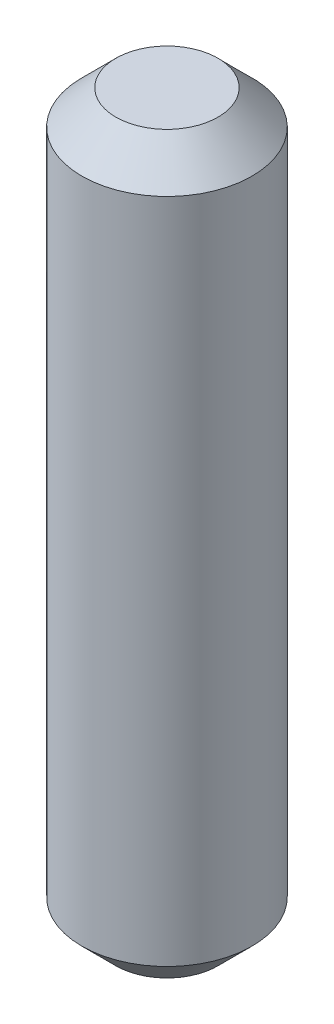
ISO-10303-21;
HEADER;
FILE_DESCRIPTION(('STEP AP214'),'2;1');
FILE_NAME('part.step','',(''),(''),'','','');
FILE_SCHEMA(('AUTOMOTIVE_DESIGN { 1 0 10303 214 1 1 1 1 }'));
ENDSEC;
DATA;
#1=APPLICATION_CONTEXT('core data for automotive mechanical design processes');
#2=APPLICATION_PROTOCOL_DEFINITION('international standard','automotive_design',2000,#1);
#3=PRODUCT_CONTEXT('',#1,'mechanical');
#4=PRODUCT('Part','Part','',(#3));
#5=PRODUCT_RELATED_PRODUCT_CATEGORY('part','',(#4));
#6=PRODUCT_DEFINITION_FORMATION('','',#4);
#7=PRODUCT_DEFINITION_CONTEXT('part definition',#1,'design');
#8=PRODUCT_DEFINITION('design','',#6,#7);
#9=PRODUCT_DEFINITION_SHAPE('','',#8);
#10=(LENGTH_UNIT() NAMED_UNIT(*) SI_UNIT(.MILLI.,.METRE.));
#11=(NAMED_UNIT(*) PLANE_ANGLE_UNIT() SI_UNIT($,.RADIAN.));
#12=(NAMED_UNIT(*) SI_UNIT($,.STERADIAN.) SOLID_ANGLE_UNIT());
#13=UNCERTAINTY_MEASURE_WITH_UNIT(LENGTH_MEASURE(1.E-05),#10,'distance_accuracy_value','');
#14=(GEOMETRIC_REPRESENTATION_CONTEXT(3) GLOBAL_UNCERTAINTY_ASSIGNED_CONTEXT((#13)) GLOBAL_UNIT_ASSIGNED_CONTEXT((#10,
#11,#12)) REPRESENTATION_CONTEXT('',''));
#15=CARTESIAN_POINT('',(0.,0.,0.));
#16=DIRECTION('',(0.,0.,1.));
#17=DIRECTION('',(1.,0.,0.));
#18=AXIS2_PLACEMENT_3D('',#15,#16,#17);
#19=CARTESIAN_POINT('',(0.,21.59,0.));
#20=DIRECTION('',(0.,-1.,0.));
#21=DIRECTION('',(0.,0.,-1.));
#22=AXIS2_PLACEMENT_3D('',#19,#20,#21);
#23=CYLINDRICAL_SURFACE('',#22,2.5);
#24=CARTESIAN_POINT('',(0.,1.,0.));
#25=DIRECTION('',(0.,1.,0.));
#26=DIRECTION('',(0.,0.,1.));
#27=AXIS2_PLACEMENT_3D('',#24,#25,#26);
#28=CIRCLE('',#27,2.5);
#29=CARTESIAN_POINT('',(0.,1.,2.5));
#30=VERTEX_POINT('',#29);
#31=EDGE_CURVE('E51',#30,#30,#28,.T.);
#32=ORIENTED_EDGE('',*,*,#31,.T.);
#33=EDGE_LOOP('',(#32));
#34=FACE_BOUND('',#33,.T.);
#35=CARTESIAN_POINT('',(0.,20.59,0.));
#36=DIRECTION('',(0.,1.,0.));
#37=DIRECTION('',(0.,0.,1.));
#38=AXIS2_PLACEMENT_3D('',#35,#36,#37);
#39=CIRCLE('',#38,2.5);
#40=CARTESIAN_POINT('',(0.,20.59,2.5));
#41=VERTEX_POINT('',#40);
#42=EDGE_CURVE('E55',#41,#41,#39,.F.);
#43=ORIENTED_EDGE('',*,*,#42,.T.);
#44=EDGE_LOOP('',(#43));
#45=FACE_BOUND('',#44,.T.);
#46=ADVANCED_FACE('F39',(#34,#45),#23,.T.);
#47=CARTESIAN_POINT('',(0.,21.59,0.));
#48=DIRECTION('',(0.,1.,0.));
#49=DIRECTION('',(0.,0.,1.));
#50=AXIS2_PLACEMENT_3D('',#47,#48,#49);
#51=PLANE('',#50);
#52=CARTESIAN_POINT('',(0.,21.59,0.));
#53=DIRECTION('',(0.,1.,0.));
#54=DIRECTION('',(0.,0.,1.));
#55=AXIS2_PLACEMENT_3D('',#52,#53,#54);
#56=CIRCLE('',#55,1.5);
#57=CARTESIAN_POINT('',(0.,21.59,1.5));
#58=VERTEX_POINT('',#57);
#59=EDGE_CURVE('E10',#58,#58,#56,.T.);
#60=ORIENTED_EDGE('',*,*,#59,.T.);
#61=EDGE_LOOP('',(#60));
#62=FACE_BOUND('',#61,.T.);
#63=ADVANCED_FACE('F71',(#62),#51,.T.);
#64=CARTESIAN_POINT('',(0.,0.,0.));
#65=DIRECTION('',(0.,1.,0.));
#66=DIRECTION('',(0.,0.,1.));
#67=AXIS2_PLACEMENT_3D('',#64,#65,#66);
#68=PLANE('',#67);
#69=CARTESIAN_POINT('',(0.,0.,0.));
#70=DIRECTION('',(0.,1.,0.));
#71=DIRECTION('',(0.,0.,1.));
#72=AXIS2_PLACEMENT_3D('',#69,#70,#71);
#73=CIRCLE('',#72,1.5);
#74=CARTESIAN_POINT('',(0.,0.,1.5));
#75=VERTEX_POINT('',#74);
#76=EDGE_CURVE('E47',#75,#75,#73,.F.);
#77=ORIENTED_EDGE('',*,*,#76,.T.);
#78=EDGE_LOOP('',(#77));
#79=FACE_BOUND('',#78,.T.);
#80=ADVANCED_FACE('F68',(#79),#68,.F.);
#81=CARTESIAN_POINT('',(0.,1.,0.));
#82=DIRECTION('',(0.,1.,0.));
#83=DIRECTION('',(0.,0.,1.));
#84=AXIS2_PLACEMENT_3D('',#81,#82,#83);
#85=CONICAL_SURFACE('',#84,2.5,0.785398163397449);
#86=ORIENTED_EDGE('',*,*,#76,.F.);
#87=EDGE_LOOP('',(#86));
#88=FACE_BOUND('',#87,.T.);
#89=ORIENTED_EDGE('',*,*,#31,.F.);
#90=EDGE_LOOP('',(#89));
#91=FACE_BOUND('',#90,.T.);
#92=ADVANCED_FACE('F64',(#88,#91),#85,.T.);
#93=CARTESIAN_POINT('',(0.,21.59,0.));
#94=DIRECTION('',(0.,-1.,0.));
#95=DIRECTION('',(0.,0.,-1.));
#96=AXIS2_PLACEMENT_3D('',#93,#94,#95);
#97=CONICAL_SURFACE('',#96,1.5,0.785398163397447);
#98=ORIENTED_EDGE('',*,*,#42,.F.);
#99=EDGE_LOOP('',(#98));
#100=FACE_BOUND('',#99,.T.);
#101=ORIENTED_EDGE('',*,*,#59,.F.);
#102=EDGE_LOOP('',(#101));
#103=FACE_BOUND('',#102,.T.);
#104=ADVANCED_FACE('F42',(#100,#103),#97,.T.);
#105=CLOSED_SHELL('',(#46,#63,#80,#92,#104));
#106=MANIFOLD_SOLID_BREP('B2',#105);
#107=ADVANCED_BREP_SHAPE_REPRESENTATION('',(#18,#106),#14);
#108=SHAPE_DEFINITION_REPRESENTATION(#9,#107);
ENDSEC;
END-ISO-10303-21;
